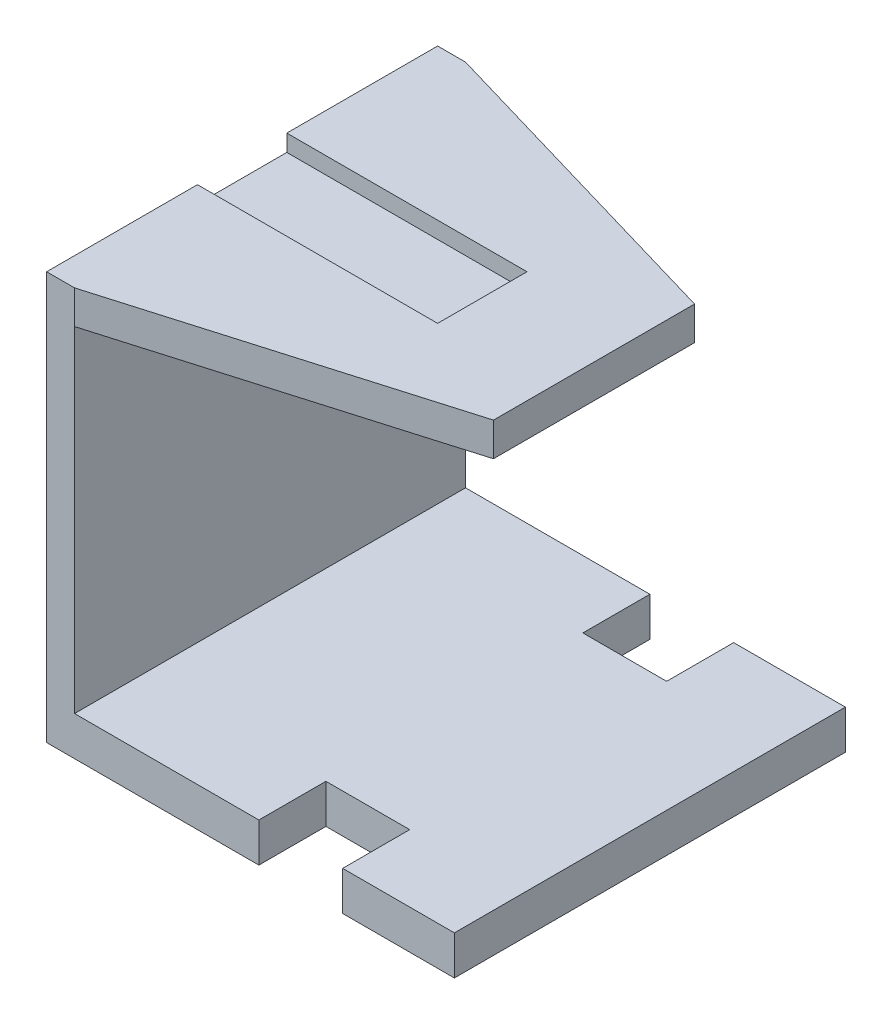
ISO-10303-21;
HEADER;
FILE_DESCRIPTION(('STEP AP214'),'2;1');
FILE_NAME('part.step','',(''),(''),'','','');
FILE_SCHEMA(('AUTOMOTIVE_DESIGN { 1 0 10303 214 1 1 1 1 }'));
ENDSEC;
DATA;
#1=APPLICATION_CONTEXT('core data for automotive mechanical design processes');
#2=APPLICATION_PROTOCOL_DEFINITION('international standard','automotive_design',2000,#1);
#3=PRODUCT_CONTEXT('',#1,'mechanical');
#4=PRODUCT('Part','Part','',(#3));
#5=PRODUCT_RELATED_PRODUCT_CATEGORY('part','',(#4));
#6=PRODUCT_DEFINITION_FORMATION('','',#4);
#7=PRODUCT_DEFINITION_CONTEXT('part definition',#1,'design');
#8=PRODUCT_DEFINITION('design','',#6,#7);
#9=PRODUCT_DEFINITION_SHAPE('','',#8);
#10=(LENGTH_UNIT() NAMED_UNIT(*) SI_UNIT(.MILLI.,.METRE.));
#11=(NAMED_UNIT(*) PLANE_ANGLE_UNIT() SI_UNIT($,.RADIAN.));
#12=(NAMED_UNIT(*) SI_UNIT($,.STERADIAN.) SOLID_ANGLE_UNIT());
#13=UNCERTAINTY_MEASURE_WITH_UNIT(LENGTH_MEASURE(1.E-05),#10,'distance_accuracy_value','');
#14=(GEOMETRIC_REPRESENTATION_CONTEXT(3) GLOBAL_UNCERTAINTY_ASSIGNED_CONTEXT((#13)) GLOBAL_UNIT_ASSIGNED_CONTEXT((#10,
#11,#12)) REPRESENTATION_CONTEXT('',''));
#15=CARTESIAN_POINT('',(0.,0.,0.));
#16=DIRECTION('',(0.,0.,1.));
#17=DIRECTION('',(1.,0.,0.));
#18=AXIS2_PLACEMENT_3D('',#15,#16,#17);
#19=CARTESIAN_POINT('',(0.,0.,35.));
#20=DIRECTION('',(0.,1.,0.));
#21=DIRECTION('',(0.,0.,1.));
#22=AXIS2_PLACEMENT_3D('',#19,#20,#21);
#23=PLANE('',#22);
#24=DIRECTION('',(0.,0.,1.));
#25=VECTOR('',#24,1.);
#26=CARTESIAN_POINT('',(2.,0.,0.));
#27=LINE('',#26,#25);
#28=CARTESIAN_POINT('',(2.,0.,0.));
#29=VERTEX_POINT('',#28);
#30=CARTESIAN_POINT('',(2.,0.,70.));
#31=VERTEX_POINT('',#30);
#32=EDGE_CURVE('E182',#29,#31,#27,.T.);
#33=ORIENTED_EDGE('',*,*,#32,.F.);
#34=DIRECTION('',(1.,0.,0.));
#35=VECTOR('',#34,1.);
#36=CARTESIAN_POINT('',(0.,0.,0.));
#37=LINE('',#36,#35);
#38=CARTESIAN_POINT('',(40.,0.,0.));
#39=VERTEX_POINT('',#38);
#40=EDGE_CURVE('E287',#29,#39,#37,.T.);
#41=ORIENTED_EDGE('',*,*,#40,.T.);
#42=DIRECTION('',(0.,0.,1.));
#43=VECTOR('',#42,1.);
#44=CARTESIAN_POINT('',(40.,0.,0.));
#45=LINE('',#44,#43);
#46=CARTESIAN_POINT('',(40.,0.,12.));
#47=VERTEX_POINT('',#46);
#48=EDGE_CURVE('E233',#39,#47,#45,.T.);
#49=ORIENTED_EDGE('',*,*,#48,.T.);
#50=DIRECTION('',(1.,0.,0.));
#51=VECTOR('',#50,1.);
#52=CARTESIAN_POINT('',(55.,0.,12.));
#53=LINE('',#52,#51);
#54=CARTESIAN_POINT('',(55.,0.,12.));
#55=VERTEX_POINT('',#54);
#56=EDGE_CURVE('E237',#47,#55,#53,.T.);
#57=ORIENTED_EDGE('',*,*,#56,.T.);
#58=DIRECTION('',(0.,0.,-1.));
#59=VECTOR('',#58,1.);
#60=CARTESIAN_POINT('',(55.,0.,0.));
#61=LINE('',#60,#59);
#62=CARTESIAN_POINT('',(55.,0.,0.));
#63=VERTEX_POINT('',#62);
#64=EDGE_CURVE('E230',#55,#63,#61,.T.);
#65=ORIENTED_EDGE('',*,*,#64,.T.);
#66=CARTESIAN_POINT('',(75.,0.,0.));
#67=VERTEX_POINT('',#66);
#68=EDGE_CURVE('E286',#63,#67,#37,.T.);
#69=ORIENTED_EDGE('',*,*,#68,.T.);
#70=DIRECTION('',(0.,0.,-1.));
#71=VECTOR('',#70,1.);
#72=CARTESIAN_POINT('',(75.,0.,35.));
#73=LINE('',#72,#71);
#74=CARTESIAN_POINT('',(75.,0.,70.));
#75=VERTEX_POINT('',#74);
#76=EDGE_CURVE('E11',#75,#67,#73,.T.);
#77=ORIENTED_EDGE('',*,*,#76,.F.);
#78=DIRECTION('',(1.,0.,0.));
#79=VECTOR('',#78,1.);
#80=CARTESIAN_POINT('',(0.,0.,70.));
#81=LINE('',#80,#79);
#82=CARTESIAN_POINT('',(55.,0.,70.));
#83=VERTEX_POINT('',#82);
#84=EDGE_CURVE('E226',#83,#75,#81,.T.);
#85=ORIENTED_EDGE('',*,*,#84,.F.);
#86=DIRECTION('',(0.,0.,1.));
#87=VECTOR('',#86,1.);
#88=CARTESIAN_POINT('',(55.,0.,70.));
#89=LINE('',#88,#87);
#90=CARTESIAN_POINT('',(55.,0.,58.));
#91=VERTEX_POINT('',#90);
#92=EDGE_CURVE('E380',#91,#83,#89,.T.);
#93=ORIENTED_EDGE('',*,*,#92,.F.);
#94=DIRECTION('',(1.,0.,0.));
#95=VECTOR('',#94,1.);
#96=CARTESIAN_POINT('',(55.,0.,58.));
#97=LINE('',#96,#95);
#98=CARTESIAN_POINT('',(40.,0.,58.));
#99=VERTEX_POINT('',#98);
#100=EDGE_CURVE('E417',#99,#91,#97,.T.);
#101=ORIENTED_EDGE('',*,*,#100,.F.);
#102=DIRECTION('',(0.,0.,-1.));
#103=VECTOR('',#102,1.);
#104=CARTESIAN_POINT('',(40.,0.,70.));
#105=LINE('',#104,#103);
#106=CARTESIAN_POINT('',(40.,0.,70.));
#107=VERTEX_POINT('',#106);
#108=EDGE_CURVE('E398',#107,#99,#105,.T.);
#109=ORIENTED_EDGE('',*,*,#108,.F.);
#110=EDGE_CURVE('E227',#31,#107,#81,.T.);
#111=ORIENTED_EDGE('',*,*,#110,.F.);
#112=EDGE_LOOP('',(#33,#41,#49,#57,#65,#69,#77,#85,#93,#101,#109,#111));
#113=FACE_BOUND('',#112,.T.);
#114=ADVANCED_FACE('F36',(#113),#23,.F.);
#115=CARTESIAN_POINT('',(0.,0.,70.));
#116=DIRECTION('',(0.,0.,-1.));
#117=DIRECTION('',(1.,0.,0.));
#118=AXIS2_PLACEMENT_3D('',#115,#116,#117);
#119=PLANE('',#118);
#120=DIRECTION('',(0.,1.,0.));
#121=VECTOR('',#120,1.);
#122=CARTESIAN_POINT('',(2.,0.,70.));
#123=LINE('',#122,#121);
#124=CARTESIAN_POINT('',(2.,73.,70.));
#125=VERTEX_POINT('',#124);
#126=EDGE_CURVE('E179',#31,#125,#123,.T.);
#127=ORIENTED_EDGE('',*,*,#126,.F.);
#128=ORIENTED_EDGE('',*,*,#110,.T.);
#129=DIRECTION('',(0.,1.,0.));
#130=VECTOR('',#129,1.);
#131=CARTESIAN_POINT('',(40.,0.,70.));
#132=LINE('',#131,#130);
#133=CARTESIAN_POINT('',(40.,7.,70.));
#134=VERTEX_POINT('',#133);
#135=EDGE_CURVE('E387',#107,#134,#132,.T.);
#136=ORIENTED_EDGE('',*,*,#135,.T.);
#137=DIRECTION('',(1.,0.,0.));
#138=VECTOR('',#137,1.);
#139=CARTESIAN_POINT('',(0.,7.,70.));
#140=LINE('',#139,#138);
#141=CARTESIAN_POINT('',(7.,7.,70.));
#142=VERTEX_POINT('',#141);
#143=EDGE_CURVE('E220',#142,#134,#140,.T.);
#144=ORIENTED_EDGE('',*,*,#143,.F.);
#145=DIRECTION('',(0.,1.,0.));
#146=VECTOR('',#145,1.);
#147=CARTESIAN_POINT('',(7.,0.,70.));
#148=LINE('',#147,#146);
#149=CARTESIAN_POINT('',(7.,67.,70.));
#150=VERTEX_POINT('',#149);
#151=EDGE_CURVE('E217',#142,#150,#148,.T.);
#152=ORIENTED_EDGE('',*,*,#151,.T.);
#153=DIRECTION('',(0.,-1.,0.));
#154=VECTOR('',#153,1.);
#155=CARTESIAN_POINT('',(7.,73.,70.));
#156=LINE('',#155,#154);
#157=CARTESIAN_POINT('',(7.,73.,70.));
#158=VERTEX_POINT('',#157);
#159=EDGE_CURVE('E202',#158,#150,#156,.T.);
#160=ORIENTED_EDGE('',*,*,#159,.F.);
#161=DIRECTION('',(-1.,0.,0.));
#162=VECTOR('',#161,1.);
#163=CARTESIAN_POINT('',(7.,73.,70.));
#164=LINE('',#163,#162);
#165=EDGE_CURVE('E193',#158,#125,#164,.T.);
#166=ORIENTED_EDGE('',*,*,#165,.T.);
#167=EDGE_LOOP('',(#127,#128,#136,#144,#152,#160,#166));
#168=FACE_BOUND('',#167,.T.);
#169=ADVANCED_FACE('F199',(#168),#119,.F.);
#170=CARTESIAN_POINT('',(0.,73.,0.));
#171=DIRECTION('',(0.,1.,0.));
#172=DIRECTION('',(0.,0.,1.));
#173=AXIS2_PLACEMENT_3D('',#170,#171,#172);
#174=PLANE('',#173);
#175=DIRECTION('',(-1.,0.,0.));
#176=VECTOR('',#175,1.);
#177=CARTESIAN_POINT('',(7.,73.,0.));
#178=LINE('',#177,#176);
#179=CARTESIAN_POINT('',(7.,73.,0.));
#180=VERTEX_POINT('',#179);
#181=CARTESIAN_POINT('',(2.,73.,0.));
#182=VERTEX_POINT('',#181);
#183=EDGE_CURVE('E275',#180,#182,#178,.T.);
#184=ORIENTED_EDGE('',*,*,#183,.T.);
#185=DIRECTION('',(0.,0.,-1.));
#186=VECTOR('',#185,1.);
#187=CARTESIAN_POINT('',(2.,73.,27.));
#188=LINE('',#187,#186);
#189=CARTESIAN_POINT('',(2.,73.,27.));
#190=VERTEX_POINT('',#189);
#191=EDGE_CURVE('E324',#190,#182,#188,.T.);
#192=ORIENTED_EDGE('',*,*,#191,.F.);
#193=DIRECTION('',(-1.,0.,0.));
#194=VECTOR('',#193,1.);
#195=CARTESIAN_POINT('',(0.,73.,27.));
#196=LINE('',#195,#194);
#197=CARTESIAN_POINT('',(45.,73.,27.));
#198=VERTEX_POINT('',#197);
#199=EDGE_CURVE('E260',#198,#190,#196,.T.);
#200=ORIENTED_EDGE('',*,*,#199,.F.);
#201=DIRECTION('',(0.,0.,-1.));
#202=VECTOR('',#201,1.);
#203=CARTESIAN_POINT('',(45.,73.,35.));
#204=LINE('',#203,#202);
#205=CARTESIAN_POINT('',(45.,73.,43.));
#206=VERTEX_POINT('',#205);
#207=EDGE_CURVE('E249',#206,#198,#204,.T.);
#208=ORIENTED_EDGE('',*,*,#207,.F.);
#209=DIRECTION('',(-1.,0.,0.));
#210=VECTOR('',#209,1.);
#211=CARTESIAN_POINT('',(0.,73.,43.));
#212=LINE('',#211,#210);
#213=CARTESIAN_POINT('',(2.,73.,43.));
#214=VERTEX_POINT('',#213);
#215=EDGE_CURVE('E196',#206,#214,#212,.T.);
#216=ORIENTED_EDGE('',*,*,#215,.T.);
#217=DIRECTION('',(0.,0.,-1.));
#218=VECTOR('',#217,1.);
#219=CARTESIAN_POINT('',(2.,73.,70.));
#220=LINE('',#219,#218);
#221=EDGE_CURVE('E52',#125,#214,#220,.T.);
#222=ORIENTED_EDGE('',*,*,#221,.F.);
#223=ORIENTED_EDGE('',*,*,#165,.F.);
#224=DIRECTION('',(-0.959628543885214,0.,0.2812704352767));
#225=VECTOR('',#224,1.);
#226=CARTESIAN_POINT('',(65.,73.,53.));
#227=LINE('',#226,#225);
#228=CARTESIAN_POINT('',(65.,73.,53.));
#229=VERTEX_POINT('',#228);
#230=EDGE_CURVE('E203',#229,#158,#227,.T.);
#231=ORIENTED_EDGE('',*,*,#230,.F.);
#232=DIRECTION('',(0.,0.,-1.));
#233=VECTOR('',#232,1.);
#234=CARTESIAN_POINT('',(65.,73.,35.));
#235=LINE('',#234,#233);
#236=CARTESIAN_POINT('',(65.,73.,17.));
#237=VERTEX_POINT('',#236);
#238=EDGE_CURVE('E270',#229,#237,#235,.T.);
#239=ORIENTED_EDGE('',*,*,#238,.T.);
#240=DIRECTION('',(-0.959628543885214,0.,-0.2812704352767));
#241=VECTOR('',#240,1.);
#242=CARTESIAN_POINT('',(65.,73.,17.));
#243=LINE('',#242,#241);
#244=EDGE_CURVE('E272',#237,#180,#243,.T.);
#245=ORIENTED_EDGE('',*,*,#244,.T.);
#246=EDGE_LOOP('',(#184,#192,#200,#208,#216,#222,#223,#231,#239,#245));
#247=FACE_BOUND('',#246,.T.);
#248=ADVANCED_FACE('F191',(#247),#174,.T.);
#249=CARTESIAN_POINT('',(0.,0.,0.));
#250=DIRECTION('',(0.,0.,1.));
#251=DIRECTION('',(1.,0.,0.));
#252=AXIS2_PLACEMENT_3D('',#249,#250,#251);
#253=PLANE('',#252);
#254=DIRECTION('',(0.,-1.,0.));
#255=VECTOR('',#254,1.);
#256=CARTESIAN_POINT('',(2.,73.,0.));
#257=LINE('',#256,#255);
#258=EDGE_CURVE('E321',#182,#29,#257,.T.);
#259=ORIENTED_EDGE('',*,*,#258,.F.);
#260=ORIENTED_EDGE('',*,*,#183,.F.);
#261=DIRECTION('',(0.,-1.,0.));
#262=VECTOR('',#261,1.);
#263=CARTESIAN_POINT('',(7.,73.,0.));
#264=LINE('',#263,#262);
#265=CARTESIAN_POINT('',(7.,67.,0.));
#266=VERTEX_POINT('',#265);
#267=EDGE_CURVE('E277',#180,#266,#264,.T.);
#268=ORIENTED_EDGE('',*,*,#267,.T.);
#269=DIRECTION('',(0.,1.,0.));
#270=VECTOR('',#269,1.);
#271=CARTESIAN_POINT('',(7.,0.,0.));
#272=LINE('',#271,#270);
#273=CARTESIAN_POINT('',(7.,7.,0.));
#274=VERTEX_POINT('',#273);
#275=EDGE_CURVE('E296',#274,#266,#272,.T.);
#276=ORIENTED_EDGE('',*,*,#275,.F.);
#277=DIRECTION('',(1.,0.,0.));
#278=VECTOR('',#277,1.);
#279=CARTESIAN_POINT('',(0.,7.,0.));
#280=LINE('',#279,#278);
#281=CARTESIAN_POINT('',(40.,7.,0.));
#282=VERTEX_POINT('',#281);
#283=EDGE_CURVE('E293',#274,#282,#280,.T.);
#284=ORIENTED_EDGE('',*,*,#283,.T.);
#285=DIRECTION('',(0.,1.,0.));
#286=VECTOR('',#285,1.);
#287=CARTESIAN_POINT('',(40.,0.,0.));
#288=LINE('',#287,#286);
#289=EDGE_CURVE('E252',#39,#282,#288,.T.);
#290=ORIENTED_EDGE('',*,*,#289,.F.);
#291=ORIENTED_EDGE('',*,*,#40,.F.);
#292=EDGE_LOOP('',(#259,#260,#268,#276,#284,#290,#291));
#293=FACE_BOUND('',#292,.T.);
#294=ADVANCED_FACE('F318',(#293),#253,.F.);
#295=CARTESIAN_POINT('',(0.,70.,27.));
#296=DIRECTION('',(0.,0.,-1.));
#297=DIRECTION('',(-1.,0.,0.));
#298=AXIS2_PLACEMENT_3D('',#295,#296,#297);
#299=PLANE('',#298);
#300=DIRECTION('',(0.,1.,0.));
#301=VECTOR('',#300,1.);
#302=CARTESIAN_POINT('',(2.,70.,27.));
#303=LINE('',#302,#301);
#304=CARTESIAN_POINT('',(2.,70.,27.));
#305=VERTEX_POINT('',#304);
#306=EDGE_CURVE('E410',#305,#190,#303,.T.);
#307=ORIENTED_EDGE('',*,*,#306,.F.);
#308=DIRECTION('',(-1.,0.,0.));
#309=VECTOR('',#308,1.);
#310=CARTESIAN_POINT('',(0.,70.,27.));
#311=LINE('',#310,#309);
#312=CARTESIAN_POINT('',(45.,70.,27.));
#313=VERTEX_POINT('',#312);
#314=EDGE_CURVE('E259',#313,#305,#311,.T.);
#315=ORIENTED_EDGE('',*,*,#314,.F.);
#316=DIRECTION('',(0.,1.,0.));
#317=VECTOR('',#316,1.);
#318=CARTESIAN_POINT('',(45.,70.,27.));
#319=LINE('',#318,#317);
#320=EDGE_CURVE('E263',#313,#198,#319,.T.);
#321=ORIENTED_EDGE('',*,*,#320,.T.);
#322=ORIENTED_EDGE('',*,*,#199,.T.);
#323=EDGE_LOOP('',(#307,#315,#321,#322));
#324=FACE_BOUND('',#323,.T.);
#325=ADVANCED_FACE('F443',(#324),#299,.F.);
#326=CARTESIAN_POINT('',(0.,70.,0.));
#327=DIRECTION('',(0.,-1.,0.));
#328=DIRECTION('',(0.,0.,-1.));
#329=AXIS2_PLACEMENT_3D('',#326,#327,#328);
#330=PLANE('',#329);
#331=DIRECTION('',(0.,0.,-1.));
#332=VECTOR('',#331,1.);
#333=CARTESIAN_POINT('',(2.,70.,43.));
#334=LINE('',#333,#332);
#335=CARTESIAN_POINT('',(2.,70.,43.));
#336=VERTEX_POINT('',#335);
#337=EDGE_CURVE('E408',#336,#305,#334,.T.);
#338=ORIENTED_EDGE('',*,*,#337,.F.);
#339=DIRECTION('',(-1.,0.,0.));
#340=VECTOR('',#339,1.);
#341=CARTESIAN_POINT('',(0.,70.,43.));
#342=LINE('',#341,#340);
#343=CARTESIAN_POINT('',(45.,70.,43.));
#344=VERTEX_POINT('',#343);
#345=EDGE_CURVE('E389',#344,#336,#342,.T.);
#346=ORIENTED_EDGE('',*,*,#345,.F.);
#347=DIRECTION('',(0.,0.,-1.));
#348=VECTOR('',#347,1.);
#349=CARTESIAN_POINT('',(45.,70.,35.));
#350=LINE('',#349,#348);
#351=EDGE_CURVE('E256',#344,#313,#350,.T.);
#352=ORIENTED_EDGE('',*,*,#351,.T.);
#353=ORIENTED_EDGE('',*,*,#314,.T.);
#354=EDGE_LOOP('',(#338,#346,#352,#353));
#355=FACE_BOUND('',#354,.T.);
#356=ADVANCED_FACE('F439',(#355),#330,.F.);
#357=CARTESIAN_POINT('',(0.,70.,43.));
#358=DIRECTION('',(0.,0.,-1.));
#359=DIRECTION('',(-1.,0.,0.));
#360=AXIS2_PLACEMENT_3D('',#357,#358,#359);
#361=PLANE('',#360);
#362=ORIENTED_EDGE('',*,*,#345,.T.);
#363=DIRECTION('',(0.,-1.,0.));
#364=VECTOR('',#363,1.);
#365=CARTESIAN_POINT('',(2.,73.,43.));
#366=LINE('',#365,#364);
#367=EDGE_CURVE('E197',#214,#336,#366,.T.);
#368=ORIENTED_EDGE('',*,*,#367,.F.);
#369=ORIENTED_EDGE('',*,*,#215,.F.);
#370=DIRECTION('',(0.,1.,0.));
#371=VECTOR('',#370,1.);
#372=CARTESIAN_POINT('',(45.,70.,43.));
#373=LINE('',#372,#371);
#374=EDGE_CURVE('E209',#344,#206,#373,.T.);
#375=ORIENTED_EDGE('',*,*,#374,.F.);
#376=EDGE_LOOP('',(#362,#368,#369,#375));
#377=FACE_BOUND('',#376,.T.);
#378=ADVANCED_FACE('F406',(#377),#361,.T.);
#379=CARTESIAN_POINT('',(0.,7.,35.));
#380=DIRECTION('',(0.,1.,0.));
#381=DIRECTION('',(0.,0.,1.));
#382=AXIS2_PLACEMENT_3D('',#379,#380,#381);
#383=PLANE('',#382);
#384=DIRECTION('',(1.,0.,0.));
#385=VECTOR('',#384,1.);
#386=CARTESIAN_POINT('',(55.,7.,58.));
#387=LINE('',#386,#385);
#388=CARTESIAN_POINT('',(40.,7.,58.));
#389=VERTEX_POINT('',#388);
#390=CARTESIAN_POINT('',(55.,7.,58.));
#391=VERTEX_POINT('',#390);
#392=EDGE_CURVE('E420',#389,#391,#387,.T.);
#393=ORIENTED_EDGE('',*,*,#392,.T.);
#394=DIRECTION('',(0.,0.,1.));
#395=VECTOR('',#394,1.);
#396=CARTESIAN_POINT('',(55.,7.,70.));
#397=LINE('',#396,#395);
#398=CARTESIAN_POINT('',(55.,7.,70.));
#399=VERTEX_POINT('',#398);
#400=EDGE_CURVE('E354',#391,#399,#397,.T.);
#401=ORIENTED_EDGE('',*,*,#400,.T.);
#402=CARTESIAN_POINT('',(75.,7.,70.));
#403=VERTEX_POINT('',#402);
#404=EDGE_CURVE('E219',#399,#403,#140,.T.);
#405=ORIENTED_EDGE('',*,*,#404,.T.);
#406=DIRECTION('',(0.,0.,-1.));
#407=VECTOR('',#406,1.);
#408=CARTESIAN_POINT('',(75.,7.,35.));
#409=LINE('',#408,#407);
#410=CARTESIAN_POINT('',(75.,7.,0.));
#411=VERTEX_POINT('',#410);
#412=EDGE_CURVE('E44',#403,#411,#409,.T.);
#413=ORIENTED_EDGE('',*,*,#412,.T.);
#414=CARTESIAN_POINT('',(55.,7.,0.));
#415=VERTEX_POINT('',#414);
#416=EDGE_CURVE('E292',#415,#411,#280,.T.);
#417=ORIENTED_EDGE('',*,*,#416,.F.);
#418=DIRECTION('',(0.,0.,-1.));
#419=VECTOR('',#418,1.);
#420=CARTESIAN_POINT('',(55.,7.,0.));
#421=LINE('',#420,#419);
#422=CARTESIAN_POINT('',(55.,7.,12.));
#423=VERTEX_POINT('',#422);
#424=EDGE_CURVE('E229',#423,#415,#421,.T.);
#425=ORIENTED_EDGE('',*,*,#424,.F.);
#426=DIRECTION('',(1.,0.,0.));
#427=VECTOR('',#426,1.);
#428=CARTESIAN_POINT('',(55.,7.,12.));
#429=LINE('',#428,#427);
#430=CARTESIAN_POINT('',(40.,7.,12.));
#431=VERTEX_POINT('',#430);
#432=EDGE_CURVE('E234',#431,#423,#429,.T.);
#433=ORIENTED_EDGE('',*,*,#432,.F.);
#434=DIRECTION('',(0.,0.,1.));
#435=VECTOR('',#434,1.);
#436=CARTESIAN_POINT('',(40.,7.,0.));
#437=LINE('',#436,#435);
#438=EDGE_CURVE('E242',#282,#431,#437,.T.);
#439=ORIENTED_EDGE('',*,*,#438,.F.);
#440=ORIENTED_EDGE('',*,*,#283,.F.);
#441=DIRECTION('',(0.,0.,-1.));
#442=VECTOR('',#441,1.);
#443=CARTESIAN_POINT('',(7.,7.,35.));
#444=LINE('',#443,#442);
#445=EDGE_CURVE('E299',#142,#274,#444,.T.);
#446=ORIENTED_EDGE('',*,*,#445,.F.);
#447=ORIENTED_EDGE('',*,*,#143,.T.);
#448=DIRECTION('',(0.,0.,-1.));
#449=VECTOR('',#448,1.);
#450=CARTESIAN_POINT('',(40.,7.,70.));
#451=LINE('',#450,#449);
#452=EDGE_CURVE('E60',#134,#389,#451,.T.);
#453=ORIENTED_EDGE('',*,*,#452,.T.);
#454=EDGE_LOOP('',(#393,#401,#405,#413,#417,#425,#433,#439,#440,#446,#447,#453));
#455=FACE_BOUND('',#454,.T.);
#456=ADVANCED_FACE('F361',(#455),#383,.T.);
#457=DIRECTION('',(0.,1.,0.));
#458=VECTOR('',#457,1.);
#459=CARTESIAN_POINT('',(55.,0.,70.));
#460=LINE('',#459,#458);
#461=EDGE_CURVE('E384',#83,#399,#460,.T.);
#462=ORIENTED_EDGE('',*,*,#461,.F.);
#463=ORIENTED_EDGE('',*,*,#84,.T.);
#464=DIRECTION('',(0.,1.,0.));
#465=VECTOR('',#464,1.);
#466=CARTESIAN_POINT('',(75.,0.,70.));
#467=LINE('',#466,#465);
#468=EDGE_CURVE('E223',#75,#403,#467,.T.);
#469=ORIENTED_EDGE('',*,*,#468,.T.);
#470=ORIENTED_EDGE('',*,*,#404,.F.);
#471=EDGE_LOOP('',(#462,#463,#469,#470));
#472=FACE_BOUND('',#471,.T.);
#473=ADVANCED_FACE('F351',(#472),#119,.F.);
#474=ORIENTED_EDGE('',*,*,#68,.F.);
#475=DIRECTION('',(0.,1.,0.));
#476=VECTOR('',#475,1.);
#477=CARTESIAN_POINT('',(55.,0.,0.));
#478=LINE('',#477,#476);
#479=EDGE_CURVE('E240',#63,#415,#478,.T.);
#480=ORIENTED_EDGE('',*,*,#479,.T.);
#481=ORIENTED_EDGE('',*,*,#416,.T.);
#482=DIRECTION('',(0.,1.,0.));
#483=VECTOR('',#482,1.);
#484=CARTESIAN_POINT('',(75.,0.,0.));
#485=LINE('',#484,#483);
#486=EDGE_CURVE('E289',#67,#411,#485,.T.);
#487=ORIENTED_EDGE('',*,*,#486,.F.);
#488=EDGE_LOOP('',(#474,#480,#481,#487));
#489=FACE_BOUND('',#488,.T.);
#490=ADVANCED_FACE('F372',(#489),#253,.F.);
#491=CARTESIAN_POINT('',(75.,0.,35.));
#492=DIRECTION('',(-1.,0.,0.));
#493=DIRECTION('',(0.,0.,1.));
#494=AXIS2_PLACEMENT_3D('',#491,#492,#493);
#495=PLANE('',#494);
#496=ORIENTED_EDGE('',*,*,#486,.T.);
#497=ORIENTED_EDGE('',*,*,#412,.F.);
#498=ORIENTED_EDGE('',*,*,#468,.F.);
#499=ORIENTED_EDGE('',*,*,#76,.T.);
#500=EDGE_LOOP('',(#496,#497,#498,#499));
#501=FACE_BOUND('',#500,.T.);
#502=ADVANCED_FACE('F375',(#501),#495,.F.);
#503=CARTESIAN_POINT('',(7.,0.,35.));
#504=DIRECTION('',(-1.,0.,0.));
#505=DIRECTION('',(0.,-1.,0.));
#506=AXIS2_PLACEMENT_3D('',#503,#504,#505);
#507=PLANE('',#506);
#508=ORIENTED_EDGE('',*,*,#275,.T.);
#509=DIRECTION('',(0.,0.,-1.));
#510=VECTOR('',#509,1.);
#511=CARTESIAN_POINT('',(7.,67.,35.));
#512=LINE('',#511,#510);
#513=EDGE_CURVE('E298',#150,#266,#512,.T.);
#514=ORIENTED_EDGE('',*,*,#513,.F.);
#515=ORIENTED_EDGE('',*,*,#151,.F.);
#516=ORIENTED_EDGE('',*,*,#445,.T.);
#517=EDGE_LOOP('',(#508,#514,#515,#516));
#518=FACE_BOUND('',#517,.T.);
#519=ADVANCED_FACE('F423',(#518),#507,.F.);
#520=CARTESIAN_POINT('',(0.,67.,0.));
#521=DIRECTION('',(0.,1.,0.));
#522=DIRECTION('',(0.,0.,1.));
#523=AXIS2_PLACEMENT_3D('',#520,#521,#522);
#524=PLANE('',#523);
#525=DIRECTION('',(0.,0.,-1.));
#526=VECTOR('',#525,1.);
#527=CARTESIAN_POINT('',(65.,67.,35.));
#528=LINE('',#527,#526);
#529=CARTESIAN_POINT('',(65.,67.,53.));
#530=VERTEX_POINT('',#529);
#531=CARTESIAN_POINT('',(65.,67.,17.));
#532=VERTEX_POINT('',#531);
#533=EDGE_CURVE('E269',#530,#532,#528,.T.);
#534=ORIENTED_EDGE('',*,*,#533,.F.);
#535=DIRECTION('',(-0.959628543885214,0.,0.2812704352767));
#536=VECTOR('',#535,1.);
#537=CARTESIAN_POINT('',(65.,67.,53.));
#538=LINE('',#537,#536);
#539=EDGE_CURVE('E204',#530,#150,#538,.T.);
#540=ORIENTED_EDGE('',*,*,#539,.T.);
#541=ORIENTED_EDGE('',*,*,#513,.T.);
#542=DIRECTION('',(-0.959628543885214,0.,-0.2812704352767));
#543=VECTOR('',#542,1.);
#544=CARTESIAN_POINT('',(65.,67.,17.));
#545=LINE('',#544,#543);
#546=EDGE_CURVE('E273',#532,#266,#545,.T.);
#547=ORIENTED_EDGE('',*,*,#546,.F.);
#548=EDGE_LOOP('',(#534,#540,#541,#547));
#549=FACE_BOUND('',#548,.T.);
#550=ADVANCED_FACE('F305',(#549),#524,.F.);
#551=CARTESIAN_POINT('',(65.,73.,35.));
#552=DIRECTION('',(-1.,0.,0.));
#553=DIRECTION('',(0.,0.,1.));
#554=AXIS2_PLACEMENT_3D('',#551,#552,#553);
#555=PLANE('',#554);
#556=ORIENTED_EDGE('',*,*,#533,.T.);
#557=DIRECTION('',(0.,-1.,0.));
#558=VECTOR('',#557,1.);
#559=CARTESIAN_POINT('',(65.,73.,17.));
#560=LINE('',#559,#558);
#561=EDGE_CURVE('E283',#237,#532,#560,.T.);
#562=ORIENTED_EDGE('',*,*,#561,.F.);
#563=ORIENTED_EDGE('',*,*,#238,.F.);
#564=DIRECTION('',(0.,-1.,0.));
#565=VECTOR('',#564,1.);
#566=CARTESIAN_POINT('',(65.,73.,53.));
#567=LINE('',#566,#565);
#568=EDGE_CURVE('E206',#229,#530,#567,.T.);
#569=ORIENTED_EDGE('',*,*,#568,.T.);
#570=EDGE_LOOP('',(#556,#562,#563,#569));
#571=FACE_BOUND('',#570,.T.);
#572=ADVANCED_FACE('F327',(#571),#555,.F.);
#573=CARTESIAN_POINT('',(65.,73.,17.));
#574=DIRECTION('',(-0.2812704352767,0.,0.959628543885214));
#575=DIRECTION('',(0.959628543885214,0.,0.2812704352767));
#576=AXIS2_PLACEMENT_3D('',#573,#574,#575);
#577=PLANE('',#576);
#578=ORIENTED_EDGE('',*,*,#546,.T.);
#579=ORIENTED_EDGE('',*,*,#267,.F.);
#580=ORIENTED_EDGE('',*,*,#244,.F.);
#581=ORIENTED_EDGE('',*,*,#561,.T.);
#582=EDGE_LOOP('',(#578,#579,#580,#581));
#583=FACE_BOUND('',#582,.T.);
#584=ADVANCED_FACE('F311',(#583),#577,.F.);
#585=CARTESIAN_POINT('',(45.,70.,35.));
#586=DIRECTION('',(1.,0.,0.));
#587=DIRECTION('',(0.,0.,-1.));
#588=AXIS2_PLACEMENT_3D('',#585,#586,#587);
#589=PLANE('',#588);
#590=ORIENTED_EDGE('',*,*,#207,.T.);
#591=ORIENTED_EDGE('',*,*,#320,.F.);
#592=ORIENTED_EDGE('',*,*,#351,.F.);
#593=ORIENTED_EDGE('',*,*,#374,.T.);
#594=EDGE_LOOP('',(#590,#591,#592,#593));
#595=FACE_BOUND('',#594,.T.);
#596=ADVANCED_FACE('F405',(#595),#589,.F.);
#597=CARTESIAN_POINT('',(55.,0.,0.));
#598=DIRECTION('',(1.,0.,0.));
#599=DIRECTION('',(0.,0.,-1.));
#600=AXIS2_PLACEMENT_3D('',#597,#598,#599);
#601=PLANE('',#600);
#602=ORIENTED_EDGE('',*,*,#424,.T.);
#603=ORIENTED_EDGE('',*,*,#479,.F.);
#604=ORIENTED_EDGE('',*,*,#64,.F.);
#605=DIRECTION('',(0.,1.,0.));
#606=VECTOR('',#605,1.);
#607=CARTESIAN_POINT('',(55.,0.,12.));
#608=LINE('',#607,#606);
#609=EDGE_CURVE('E247',#55,#423,#608,.T.);
#610=ORIENTED_EDGE('',*,*,#609,.T.);
#611=EDGE_LOOP('',(#602,#603,#604,#610));
#612=FACE_BOUND('',#611,.T.);
#613=ADVANCED_FACE('F483',(#612),#601,.F.);
#614=CARTESIAN_POINT('',(55.,0.,12.));
#615=DIRECTION('',(0.,0.,1.));
#616=DIRECTION('',(1.,0.,0.));
#617=AXIS2_PLACEMENT_3D('',#614,#615,#616);
#618=PLANE('',#617);
#619=ORIENTED_EDGE('',*,*,#432,.T.);
#620=ORIENTED_EDGE('',*,*,#609,.F.);
#621=ORIENTED_EDGE('',*,*,#56,.F.);
#622=DIRECTION('',(0.,1.,0.));
#623=VECTOR('',#622,1.);
#624=CARTESIAN_POINT('',(40.,0.,12.));
#625=LINE('',#624,#623);
#626=EDGE_CURVE('E250',#47,#431,#625,.T.);
#627=ORIENTED_EDGE('',*,*,#626,.T.);
#628=EDGE_LOOP('',(#619,#620,#621,#627));
#629=FACE_BOUND('',#628,.T.);
#630=ADVANCED_FACE('F341',(#629),#618,.F.);
#631=CARTESIAN_POINT('',(40.,0.,0.));
#632=DIRECTION('',(-1.,0.,0.));
#633=DIRECTION('',(0.,0.,1.));
#634=AXIS2_PLACEMENT_3D('',#631,#632,#633);
#635=PLANE('',#634);
#636=ORIENTED_EDGE('',*,*,#438,.T.);
#637=ORIENTED_EDGE('',*,*,#626,.F.);
#638=ORIENTED_EDGE('',*,*,#48,.F.);
#639=ORIENTED_EDGE('',*,*,#289,.T.);
#640=EDGE_LOOP('',(#636,#637,#638,#639));
#641=FACE_BOUND('',#640,.T.);
#642=ADVANCED_FACE('F332',(#641),#635,.F.);
#643=CARTESIAN_POINT('',(65.,73.,53.));
#644=DIRECTION('',(0.2812704352767,0.,0.959628543885214));
#645=DIRECTION('',(0.959628543885214,0.,-0.2812704352767));
#646=AXIS2_PLACEMENT_3D('',#643,#644,#645);
#647=PLANE('',#646);
#648=ORIENTED_EDGE('',*,*,#539,.F.);
#649=ORIENTED_EDGE('',*,*,#568,.F.);
#650=ORIENTED_EDGE('',*,*,#230,.T.);
#651=ORIENTED_EDGE('',*,*,#159,.T.);
#652=EDGE_LOOP('',(#648,#649,#650,#651));
#653=FACE_BOUND('',#652,.T.);
#654=ADVANCED_FACE('F329',(#653),#647,.T.);
#655=CARTESIAN_POINT('',(55.,0.,70.));
#656=DIRECTION('',(-1.,0.,0.));
#657=DIRECTION('',(0.,0.,1.));
#658=AXIS2_PLACEMENT_3D('',#655,#656,#657);
#659=PLANE('',#658);
#660=ORIENTED_EDGE('',*,*,#400,.F.);
#661=DIRECTION('',(0.,1.,0.));
#662=VECTOR('',#661,1.);
#663=CARTESIAN_POINT('',(55.,0.,58.));
#664=LINE('',#663,#662);
#665=EDGE_CURVE('E396',#91,#391,#664,.T.);
#666=ORIENTED_EDGE('',*,*,#665,.F.);
#667=ORIENTED_EDGE('',*,*,#92,.T.);
#668=ORIENTED_EDGE('',*,*,#461,.T.);
#669=EDGE_LOOP('',(#660,#666,#667,#668));
#670=FACE_BOUND('',#669,.T.);
#671=ADVANCED_FACE('F331',(#670),#659,.T.);
#672=CARTESIAN_POINT('',(40.,0.,70.));
#673=DIRECTION('',(1.,0.,0.));
#674=DIRECTION('',(0.,0.,-1.));
#675=AXIS2_PLACEMENT_3D('',#672,#673,#674);
#676=PLANE('',#675);
#677=ORIENTED_EDGE('',*,*,#452,.F.);
#678=ORIENTED_EDGE('',*,*,#135,.F.);
#679=ORIENTED_EDGE('',*,*,#108,.T.);
#680=DIRECTION('',(0.,1.,0.));
#681=VECTOR('',#680,1.);
#682=CARTESIAN_POINT('',(40.,0.,58.));
#683=LINE('',#682,#681);
#684=EDGE_CURVE('E390',#99,#389,#683,.T.);
#685=ORIENTED_EDGE('',*,*,#684,.T.);
#686=EDGE_LOOP('',(#677,#678,#679,#685));
#687=FACE_BOUND('',#686,.T.);
#688=ADVANCED_FACE('F338',(#687),#676,.T.);
#689=CARTESIAN_POINT('',(55.,0.,58.));
#690=DIRECTION('',(0.,0.,1.));
#691=DIRECTION('',(1.,0.,0.));
#692=AXIS2_PLACEMENT_3D('',#689,#690,#691);
#693=PLANE('',#692);
#694=ORIENTED_EDGE('',*,*,#392,.F.);
#695=ORIENTED_EDGE('',*,*,#684,.F.);
#696=ORIENTED_EDGE('',*,*,#100,.T.);
#697=ORIENTED_EDGE('',*,*,#665,.T.);
#698=EDGE_LOOP('',(#694,#695,#696,#697));
#699=FACE_BOUND('',#698,.T.);
#700=ADVANCED_FACE('F447',(#699),#693,.T.);
#701=CARTESIAN_POINT('',(2.,0.,0.));
#702=DIRECTION('',(-1.,0.,0.));
#703=DIRECTION('',(0.,0.,1.));
#704=AXIS2_PLACEMENT_3D('',#701,#702,#703);
#705=PLANE('',#704);
#706=ORIENTED_EDGE('',*,*,#126,.T.);
#707=ORIENTED_EDGE('',*,*,#221,.T.);
#708=ORIENTED_EDGE('',*,*,#367,.T.);
#709=ORIENTED_EDGE('',*,*,#337,.T.);
#710=ORIENTED_EDGE('',*,*,#306,.T.);
#711=ORIENTED_EDGE('',*,*,#191,.T.);
#712=ORIENTED_EDGE('',*,*,#258,.T.);
#713=ORIENTED_EDGE('',*,*,#32,.T.);
#714=EDGE_LOOP('',(#706,#707,#708,#709,#710,#711,#712,#713));
#715=FACE_BOUND('',#714,.T.);
#716=ADVANCED_FACE('F180',(#715),#705,.T.);
#717=CLOSED_SHELL('',(#114,#169,#248,#294,#325,#356,#378,#456,#473,#490,#502,#519,#550,#572,
#584,#596,#613,#630,#642,#654,#671,#688,#700,#716));
#718=MANIFOLD_SOLID_BREP('B2',#717);
#719=ADVANCED_BREP_SHAPE_REPRESENTATION('',(#18,#718),#14);
#720=SHAPE_DEFINITION_REPRESENTATION(#9,#719);
ENDSEC;
END-ISO-10303-21;
